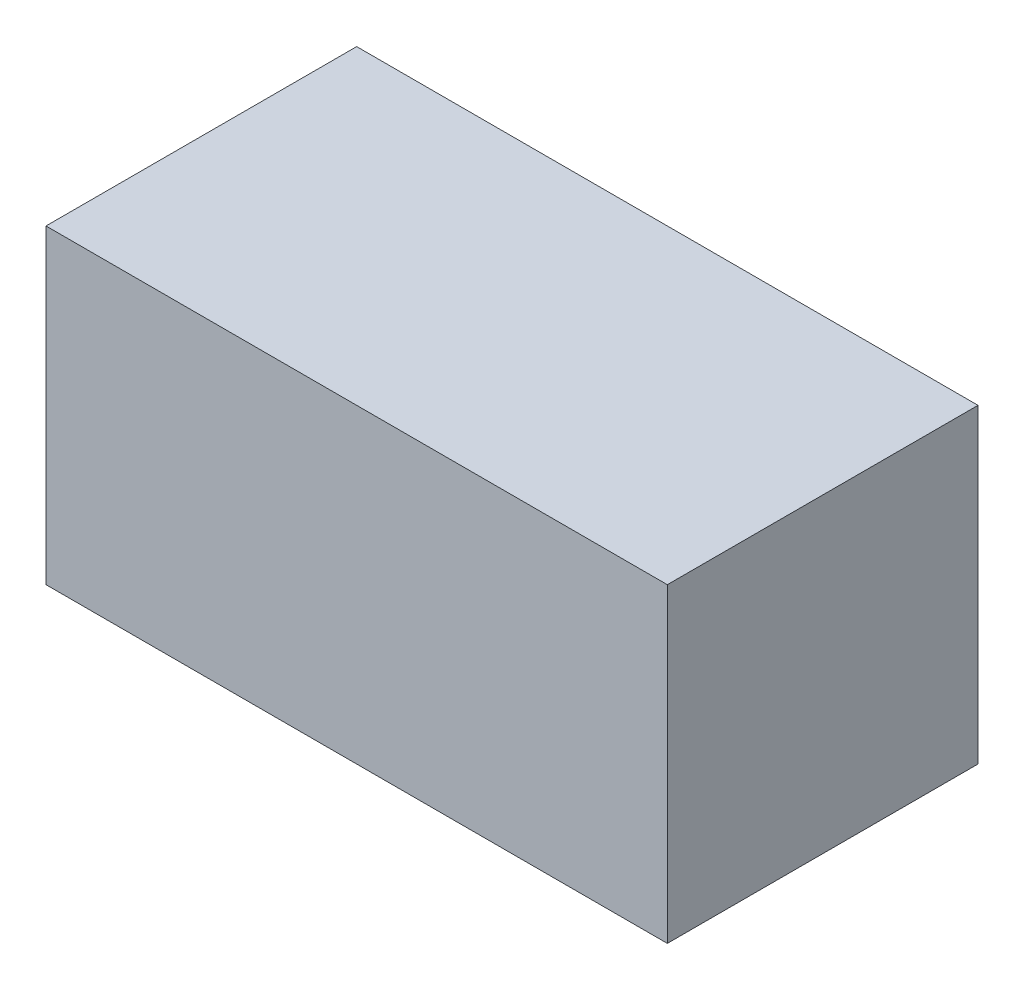
ISO-10303-21;
HEADER;
FILE_DESCRIPTION(('STEP AP214'),'2;1');
FILE_NAME('part.step','',(''),(''),'','','');
FILE_SCHEMA(('AUTOMOTIVE_DESIGN { 1 0 10303 214 1 1 1 1 }'));
ENDSEC;
DATA;
#1=APPLICATION_CONTEXT('core data for automotive mechanical design processes');
#2=APPLICATION_PROTOCOL_DEFINITION('international standard','automotive_design',2000,#1);
#3=PRODUCT_CONTEXT('',#1,'mechanical');
#4=PRODUCT('Part','Part','',(#3));
#5=PRODUCT_RELATED_PRODUCT_CATEGORY('part','',(#4));
#6=PRODUCT_DEFINITION_FORMATION('','',#4);
#7=PRODUCT_DEFINITION_CONTEXT('part definition',#1,'design');
#8=PRODUCT_DEFINITION('design','',#6,#7);
#9=PRODUCT_DEFINITION_SHAPE('','',#8);
#10=(LENGTH_UNIT() NAMED_UNIT(*) SI_UNIT(.MILLI.,.METRE.));
#11=(NAMED_UNIT(*) PLANE_ANGLE_UNIT() SI_UNIT($,.RADIAN.));
#12=(NAMED_UNIT(*) SI_UNIT($,.STERADIAN.) SOLID_ANGLE_UNIT());
#13=UNCERTAINTY_MEASURE_WITH_UNIT(LENGTH_MEASURE(1.E-05),#10,'distance_accuracy_value','');
#14=(GEOMETRIC_REPRESENTATION_CONTEXT(3) GLOBAL_UNCERTAINTY_ASSIGNED_CONTEXT((#13)) GLOBAL_UNIT_ASSIGNED_CONTEXT((#10,
#11,#12)) REPRESENTATION_CONTEXT('',''));
#15=CARTESIAN_POINT('',(0.,0.,0.));
#16=DIRECTION('',(0.,0.,1.));
#17=DIRECTION('',(1.,0.,0.));
#18=AXIS2_PLACEMENT_3D('',#15,#16,#17);
#19=CARTESIAN_POINT('',(0.,50.,0.));
#20=DIRECTION('',(1.,0.,0.));
#21=DIRECTION('',(0.,0.,-1.));
#22=AXIS2_PLACEMENT_3D('',#19,#20,#21);
#23=PLANE('',#22);
#24=DIRECTION('',(0.,0.,1.));
#25=VECTOR('',#24,1.);
#26=CARTESIAN_POINT('',(0.,0.,0.));
#27=LINE('',#26,#25);
#28=CARTESIAN_POINT('',(0.,0.,-50.));
#29=VERTEX_POINT('',#28);
#30=CARTESIAN_POINT('',(0.,0.,0.));
#31=VERTEX_POINT('',#30);
#32=EDGE_CURVE('E113',#29,#31,#27,.T.);
#33=ORIENTED_EDGE('',*,*,#32,.T.);
#34=DIRECTION('',(0.,-1.,0.));
#35=VECTOR('',#34,1.);
#36=CARTESIAN_POINT('',(0.,50.,0.));
#37=LINE('',#36,#35);
#38=CARTESIAN_POINT('',(0.,50.,0.));
#39=VERTEX_POINT('',#38);
#40=EDGE_CURVE('E11',#39,#31,#37,.T.);
#41=ORIENTED_EDGE('',*,*,#40,.F.);
#42=DIRECTION('',(0.,0.,1.));
#43=VECTOR('',#42,1.);
#44=CARTESIAN_POINT('',(0.,50.,0.));
#45=LINE('',#44,#43);
#46=CARTESIAN_POINT('',(0.,50.,-50.));
#47=VERTEX_POINT('',#46);
#48=EDGE_CURVE('E97',#47,#39,#45,.T.);
#49=ORIENTED_EDGE('',*,*,#48,.F.);
#50=DIRECTION('',(0.,-1.,0.));
#51=VECTOR('',#50,1.);
#52=CARTESIAN_POINT('',(0.,50.,-50.));
#53=LINE('',#52,#51);
#54=EDGE_CURVE('E109',#47,#29,#53,.T.);
#55=ORIENTED_EDGE('',*,*,#54,.T.);
#56=EDGE_LOOP('',(#33,#41,#49,#55));
#57=FACE_BOUND('',#56,.T.);
#58=ADVANCED_FACE('F45',(#57),#23,.F.);
#59=CARTESIAN_POINT('',(0.,50.,0.));
#60=DIRECTION('',(0.,0.,-1.));
#61=DIRECTION('',(-1.,0.,0.));
#62=AXIS2_PLACEMENT_3D('',#59,#60,#61);
#63=PLANE('',#62);
#64=DIRECTION('',(1.,0.,0.));
#65=VECTOR('',#64,1.);
#66=CARTESIAN_POINT('',(0.,0.,0.));
#67=LINE('',#66,#65);
#68=CARTESIAN_POINT('',(100.,0.,0.));
#69=VERTEX_POINT('',#68);
#70=EDGE_CURVE('E102',#31,#69,#67,.T.);
#71=ORIENTED_EDGE('',*,*,#70,.T.);
#72=DIRECTION('',(0.,-1.,0.));
#73=VECTOR('',#72,1.);
#74=CARTESIAN_POINT('',(100.,50.,0.));
#75=LINE('',#74,#73);
#76=CARTESIAN_POINT('',(100.,50.,0.));
#77=VERTEX_POINT('',#76);
#78=EDGE_CURVE('E54',#77,#69,#75,.T.);
#79=ORIENTED_EDGE('',*,*,#78,.F.);
#80=DIRECTION('',(1.,0.,0.));
#81=VECTOR('',#80,1.);
#82=CARTESIAN_POINT('',(0.,50.,0.));
#83=LINE('',#82,#81);
#84=EDGE_CURVE('E92',#39,#77,#83,.T.);
#85=ORIENTED_EDGE('',*,*,#84,.F.);
#86=ORIENTED_EDGE('',*,*,#40,.T.);
#87=EDGE_LOOP('',(#71,#79,#85,#86));
#88=FACE_BOUND('',#87,.T.);
#89=ADVANCED_FACE('F101',(#88),#63,.F.);
#90=CARTESIAN_POINT('',(100.,50.,0.));
#91=DIRECTION('',(-1.,0.,0.));
#92=DIRECTION('',(0.,0.,1.));
#93=AXIS2_PLACEMENT_3D('',#90,#91,#92);
#94=PLANE('',#93);
#95=DIRECTION('',(0.,0.,-1.));
#96=VECTOR('',#95,1.);
#97=CARTESIAN_POINT('',(100.,0.,0.));
#98=LINE('',#97,#96);
#99=CARTESIAN_POINT('',(100.,0.,-50.));
#100=VERTEX_POINT('',#99);
#101=EDGE_CURVE('E79',#69,#100,#98,.T.);
#102=ORIENTED_EDGE('',*,*,#101,.T.);
#103=DIRECTION('',(0.,-1.,0.));
#104=VECTOR('',#103,1.);
#105=CARTESIAN_POINT('',(100.,50.,-50.));
#106=LINE('',#105,#104);
#107=CARTESIAN_POINT('',(100.,50.,-50.));
#108=VERTEX_POINT('',#107);
#109=EDGE_CURVE('E104',#108,#100,#106,.T.);
#110=ORIENTED_EDGE('',*,*,#109,.F.);
#111=DIRECTION('',(0.,0.,-1.));
#112=VECTOR('',#111,1.);
#113=CARTESIAN_POINT('',(100.,50.,0.));
#114=LINE('',#113,#112);
#115=EDGE_CURVE('E95',#77,#108,#114,.T.);
#116=ORIENTED_EDGE('',*,*,#115,.F.);
#117=ORIENTED_EDGE('',*,*,#78,.T.);
#118=EDGE_LOOP('',(#102,#110,#116,#117));
#119=FACE_BOUND('',#118,.T.);
#120=ADVANCED_FACE('F105',(#119),#94,.F.);
#121=CARTESIAN_POINT('',(0.,50.,-50.));
#122=DIRECTION('',(0.,0.,1.));
#123=DIRECTION('',(1.,0.,0.));
#124=AXIS2_PLACEMENT_3D('',#121,#122,#123);
#125=PLANE('',#124);
#126=DIRECTION('',(-1.,0.,0.));
#127=VECTOR('',#126,1.);
#128=CARTESIAN_POINT('',(0.,0.,-50.));
#129=LINE('',#128,#127);
#130=EDGE_CURVE('E85',#100,#29,#129,.T.);
#131=ORIENTED_EDGE('',*,*,#130,.T.);
#132=ORIENTED_EDGE('',*,*,#54,.F.);
#133=DIRECTION('',(-1.,0.,0.));
#134=VECTOR('',#133,1.);
#135=CARTESIAN_POINT('',(0.,50.,-50.));
#136=LINE('',#135,#134);
#137=EDGE_CURVE('E62',#108,#47,#136,.T.);
#138=ORIENTED_EDGE('',*,*,#137,.F.);
#139=ORIENTED_EDGE('',*,*,#109,.T.);
#140=EDGE_LOOP('',(#131,#132,#138,#139));
#141=FACE_BOUND('',#140,.T.);
#142=ADVANCED_FACE('F126',(#141),#125,.F.);
#143=CARTESIAN_POINT('',(0.,50.,0.));
#144=DIRECTION('',(0.,-1.,0.));
#145=DIRECTION('',(0.,0.,-1.));
#146=AXIS2_PLACEMENT_3D('',#143,#144,#145);
#147=PLANE('',#146);
#148=ORIENTED_EDGE('',*,*,#48,.T.);
#149=ORIENTED_EDGE('',*,*,#84,.T.);
#150=ORIENTED_EDGE('',*,*,#115,.T.);
#151=ORIENTED_EDGE('',*,*,#137,.T.);
#152=EDGE_LOOP('',(#148,#149,#150,#151));
#153=FACE_BOUND('',#152,.T.);
#154=ADVANCED_FACE('F93',(#153),#147,.F.);
#155=CARTESIAN_POINT('',(0.,0.,0.));
#156=DIRECTION('',(0.,-1.,0.));
#157=DIRECTION('',(0.,0.,-1.));
#158=AXIS2_PLACEMENT_3D('',#155,#156,#157);
#159=PLANE('',#158);
#160=ORIENTED_EDGE('',*,*,#32,.F.);
#161=ORIENTED_EDGE('',*,*,#130,.F.);
#162=ORIENTED_EDGE('',*,*,#101,.F.);
#163=ORIENTED_EDGE('',*,*,#70,.F.);
#164=EDGE_LOOP('',(#160,#161,#162,#163));
#165=FACE_BOUND('',#164,.T.);
#166=ADVANCED_FACE('F129',(#165),#159,.T.);
#167=CLOSED_SHELL('',(#58,#89,#120,#142,#154,#166));
#168=MANIFOLD_SOLID_BREP('B2',#167);
#169=ADVANCED_BREP_SHAPE_REPRESENTATION('',(#18,#168),#14);
#170=SHAPE_DEFINITION_REPRESENTATION(#9,#169);
ENDSEC;
END-ISO-10303-21;
